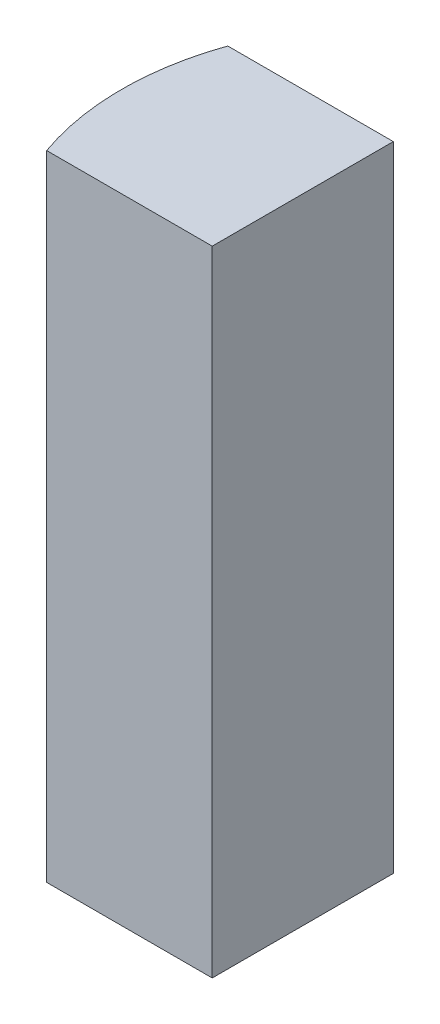
ISO-10303-21;
HEADER;
FILE_DESCRIPTION(('STEP AP214'),'2;1');
FILE_NAME('part.step','',(''),(''),'','','');
FILE_SCHEMA(('AUTOMOTIVE_DESIGN { 1 0 10303 214 1 1 1 1 }'));
ENDSEC;
DATA;
#1=APPLICATION_CONTEXT('core data for automotive mechanical design processes');
#2=APPLICATION_PROTOCOL_DEFINITION('international standard','automotive_design',2000,#1);
#3=PRODUCT_CONTEXT('',#1,'mechanical');
#4=PRODUCT('Part','Part','',(#3));
#5=PRODUCT_RELATED_PRODUCT_CATEGORY('part','',(#4));
#6=PRODUCT_DEFINITION_FORMATION('','',#4);
#7=PRODUCT_DEFINITION_CONTEXT('part definition',#1,'design');
#8=PRODUCT_DEFINITION('design','',#6,#7);
#9=PRODUCT_DEFINITION_SHAPE('','',#8);
#10=(LENGTH_UNIT() NAMED_UNIT(*) SI_UNIT(.MILLI.,.METRE.));
#11=(NAMED_UNIT(*) PLANE_ANGLE_UNIT() SI_UNIT($,.RADIAN.));
#12=(NAMED_UNIT(*) SI_UNIT($,.STERADIAN.) SOLID_ANGLE_UNIT());
#13=UNCERTAINTY_MEASURE_WITH_UNIT(LENGTH_MEASURE(1.E-05),#10,'distance_accuracy_value','');
#14=(GEOMETRIC_REPRESENTATION_CONTEXT(3) GLOBAL_UNCERTAINTY_ASSIGNED_CONTEXT((#13)) GLOBAL_UNIT_ASSIGNED_CONTEXT((#10,
#11,#12)) REPRESENTATION_CONTEXT('',''));
#15=CARTESIAN_POINT('',(0.,0.,0.));
#16=DIRECTION('',(0.,0.,1.));
#17=DIRECTION('',(1.,0.,0.));
#18=AXIS2_PLACEMENT_3D('',#15,#16,#17);
#19=CARTESIAN_POINT('',(0.,140.,-20.));
#20=DIRECTION('',(0.,0.,-1.));
#21=DIRECTION('',(-1.,0.,0.));
#22=AXIS2_PLACEMENT_3D('',#19,#20,#21);
#23=PLANE('',#22);
#24=DIRECTION('',(1.,0.,0.));
#25=VECTOR('',#24,1.);
#26=CARTESIAN_POINT('',(0.,0.,-20.));
#27=LINE('',#26,#25);
#28=CARTESIAN_POINT('',(-56.5685424949238,0.,-20.));
#29=VERTEX_POINT('',#28);
#30=CARTESIAN_POINT('',(-20.,0.,-20.));
#31=VERTEX_POINT('',#30);
#32=EDGE_CURVE('E100',#29,#31,#27,.T.);
#33=ORIENTED_EDGE('',*,*,#32,.F.);
#34=DIRECTION('',(0.,-1.,0.));
#35=VECTOR('',#34,1.);
#36=CARTESIAN_POINT('',(-56.5685424949238,140.,-20.));
#37=LINE('',#36,#35);
#38=CARTESIAN_POINT('',(-56.5685424949238,140.,-20.));
#39=VERTEX_POINT('',#38);
#40=EDGE_CURVE('E11',#39,#29,#37,.T.);
#41=ORIENTED_EDGE('',*,*,#40,.F.);
#42=DIRECTION('',(1.,0.,0.));
#43=VECTOR('',#42,1.);
#44=CARTESIAN_POINT('',(0.,140.,-20.));
#45=LINE('',#44,#43);
#46=CARTESIAN_POINT('',(-20.,140.,-20.));
#47=VERTEX_POINT('',#46);
#48=EDGE_CURVE('E85',#39,#47,#45,.T.);
#49=ORIENTED_EDGE('',*,*,#48,.T.);
#50=DIRECTION('',(0.,-1.,0.));
#51=VECTOR('',#50,1.);
#52=CARTESIAN_POINT('',(-20.,140.,-20.));
#53=LINE('',#52,#51);
#54=EDGE_CURVE('E53',#47,#31,#53,.T.);
#55=ORIENTED_EDGE('',*,*,#54,.T.);
#56=EDGE_LOOP('',(#33,#41,#49,#55));
#57=FACE_BOUND('',#56,.T.);
#58=ADVANCED_FACE('F37',(#57),#23,.T.);
#59=CARTESIAN_POINT('',(0.,140.,0.));
#60=DIRECTION('',(0.,-1.,0.));
#61=DIRECTION('',(0.,0.,-1.));
#62=AXIS2_PLACEMENT_3D('',#59,#60,#61);
#63=CYLINDRICAL_SURFACE('',#62,60.);
#64=CARTESIAN_POINT('',(0.,0.,0.));
#65=DIRECTION('',(0.,1.,0.));
#66=DIRECTION('',(0.,0.,1.));
#67=AXIS2_PLACEMENT_3D('',#64,#65,#66);
#68=CIRCLE('',#67,60.);
#69=CARTESIAN_POINT('',(-56.5685424949238,0.,20.));
#70=VERTEX_POINT('',#69);
#71=EDGE_CURVE('E91',#29,#70,#68,.T.);
#72=ORIENTED_EDGE('',*,*,#71,.T.);
#73=DIRECTION('',(0.,-1.,0.));
#74=VECTOR('',#73,1.);
#75=CARTESIAN_POINT('',(-56.5685424949238,140.,20.));
#76=LINE('',#75,#74);
#77=CARTESIAN_POINT('',(-56.5685424949238,140.,20.));
#78=VERTEX_POINT('',#77);
#79=EDGE_CURVE('E45',#78,#70,#76,.T.);
#80=ORIENTED_EDGE('',*,*,#79,.F.);
#81=CARTESIAN_POINT('',(0.,140.,0.));
#82=DIRECTION('',(0.,1.,0.));
#83=DIRECTION('',(0.,0.,1.));
#84=AXIS2_PLACEMENT_3D('',#81,#82,#83);
#85=CIRCLE('',#84,60.);
#86=EDGE_CURVE('E79',#39,#78,#85,.T.);
#87=ORIENTED_EDGE('',*,*,#86,.F.);
#88=ORIENTED_EDGE('',*,*,#40,.T.);
#89=EDGE_LOOP('',(#72,#80,#87,#88));
#90=FACE_BOUND('',#89,.T.);
#91=ADVANCED_FACE('F89',(#90),#63,.T.);
#92=CARTESIAN_POINT('',(0.,140.,20.));
#93=DIRECTION('',(0.,0.,-1.));
#94=DIRECTION('',(-1.,0.,0.));
#95=AXIS2_PLACEMENT_3D('',#92,#93,#94);
#96=PLANE('',#95);
#97=DIRECTION('',(1.,0.,0.));
#98=VECTOR('',#97,1.);
#99=CARTESIAN_POINT('',(0.,0.,20.));
#100=LINE('',#99,#98);
#101=CARTESIAN_POINT('',(-20.,0.,20.));
#102=VERTEX_POINT('',#101);
#103=EDGE_CURVE('E103',#70,#102,#100,.T.);
#104=ORIENTED_EDGE('',*,*,#103,.T.);
#105=DIRECTION('',(0.,-1.,0.));
#106=VECTOR('',#105,1.);
#107=CARTESIAN_POINT('',(-20.,140.,20.));
#108=LINE('',#107,#106);
#109=CARTESIAN_POINT('',(-20.,140.,20.));
#110=VERTEX_POINT('',#109);
#111=EDGE_CURVE('E67',#110,#102,#108,.T.);
#112=ORIENTED_EDGE('',*,*,#111,.F.);
#113=DIRECTION('',(1.,0.,0.));
#114=VECTOR('',#113,1.);
#115=CARTESIAN_POINT('',(0.,140.,20.));
#116=LINE('',#115,#114);
#117=EDGE_CURVE('E84',#78,#110,#116,.T.);
#118=ORIENTED_EDGE('',*,*,#117,.F.);
#119=ORIENTED_EDGE('',*,*,#79,.T.);
#120=EDGE_LOOP('',(#104,#112,#118,#119));
#121=FACE_BOUND('',#120,.T.);
#122=ADVANCED_FACE('F94',(#121),#96,.F.);
#123=CARTESIAN_POINT('',(-20.,140.,0.));
#124=DIRECTION('',(1.,0.,0.));
#125=DIRECTION('',(0.,0.,-1.));
#126=AXIS2_PLACEMENT_3D('',#123,#124,#125);
#127=PLANE('',#126);
#128=DIRECTION('',(0.,0.,1.));
#129=VECTOR('',#128,1.);
#130=CARTESIAN_POINT('',(-20.,0.,0.));
#131=LINE('',#130,#129);
#132=EDGE_CURVE('E105',#31,#102,#131,.T.);
#133=ORIENTED_EDGE('',*,*,#132,.F.);
#134=ORIENTED_EDGE('',*,*,#54,.F.);
#135=DIRECTION('',(0.,0.,1.));
#136=VECTOR('',#135,1.);
#137=CARTESIAN_POINT('',(-20.,140.,0.));
#138=LINE('',#137,#136);
#139=EDGE_CURVE('E95',#47,#110,#138,.T.);
#140=ORIENTED_EDGE('',*,*,#139,.T.);
#141=ORIENTED_EDGE('',*,*,#111,.T.);
#142=EDGE_LOOP('',(#133,#134,#140,#141));
#143=FACE_BOUND('',#142,.T.);
#144=ADVANCED_FACE('F110',(#143),#127,.T.);
#145=CARTESIAN_POINT('',(0.,140.,0.));
#146=DIRECTION('',(0.,1.,0.));
#147=DIRECTION('',(0.,0.,1.));
#148=AXIS2_PLACEMENT_3D('',#145,#146,#147);
#149=PLANE('',#148);
#150=ORIENTED_EDGE('',*,*,#48,.F.);
#151=ORIENTED_EDGE('',*,*,#86,.T.);
#152=ORIENTED_EDGE('',*,*,#117,.T.);
#153=ORIENTED_EDGE('',*,*,#139,.F.);
#154=EDGE_LOOP('',(#150,#151,#152,#153));
#155=FACE_BOUND('',#154,.T.);
#156=ADVANCED_FACE('F81',(#155),#149,.T.);
#157=CARTESIAN_POINT('',(0.,0.,0.));
#158=DIRECTION('',(0.,1.,0.));
#159=DIRECTION('',(0.,0.,1.));
#160=AXIS2_PLACEMENT_3D('',#157,#158,#159);
#161=PLANE('',#160);
#162=ORIENTED_EDGE('',*,*,#32,.T.);
#163=ORIENTED_EDGE('',*,*,#132,.T.);
#164=ORIENTED_EDGE('',*,*,#103,.F.);
#165=ORIENTED_EDGE('',*,*,#71,.F.);
#166=EDGE_LOOP('',(#162,#163,#164,#165));
#167=FACE_BOUND('',#166,.T.);
#168=ADVANCED_FACE('F117',(#167),#161,.F.);
#169=CLOSED_SHELL('',(#58,#91,#122,#144,#156,#168));
#170=MANIFOLD_SOLID_BREP('B2',#169);
#171=ADVANCED_BREP_SHAPE_REPRESENTATION('',(#18,#170),#14);
#172=SHAPE_DEFINITION_REPRESENTATION(#9,#171);
ENDSEC;
END-ISO-10303-21;
